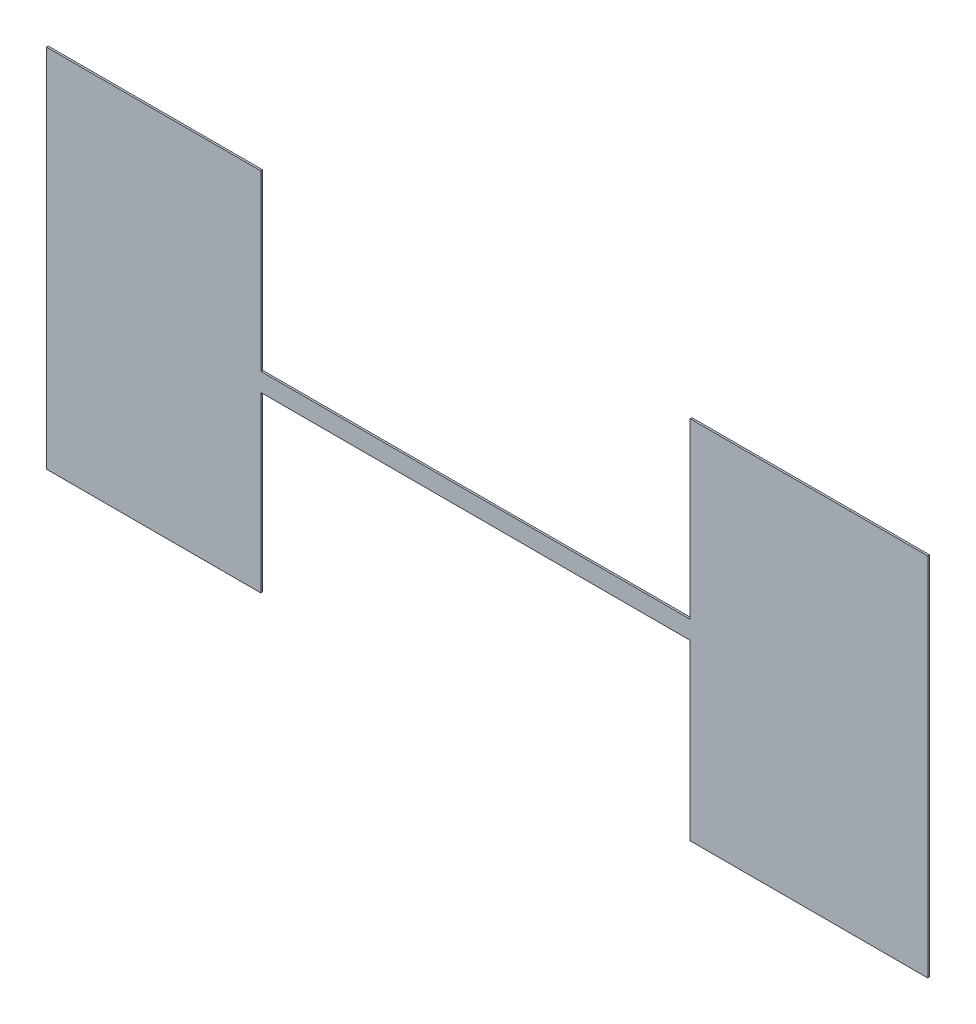
ISO-10303-21;
HEADER;
FILE_DESCRIPTION(('STEP AP214'),'2;1');
FILE_NAME('part.step','',(''),(''),'','','');
FILE_SCHEMA(('AUTOMOTIVE_DESIGN { 1 0 10303 214 1 1 1 1 }'));
ENDSEC;
DATA;
#1=APPLICATION_CONTEXT('core data for automotive mechanical design processes');
#2=APPLICATION_PROTOCOL_DEFINITION('international standard','automotive_design',2000,#1);
#3=PRODUCT_CONTEXT('',#1,'mechanical');
#4=PRODUCT('Part','Part','',(#3));
#5=PRODUCT_RELATED_PRODUCT_CATEGORY('part','',(#4));
#6=PRODUCT_DEFINITION_FORMATION('','',#4);
#7=PRODUCT_DEFINITION_CONTEXT('part definition',#1,'design');
#8=PRODUCT_DEFINITION('design','',#6,#7);
#9=PRODUCT_DEFINITION_SHAPE('','',#8);
#10=(LENGTH_UNIT() NAMED_UNIT(*) SI_UNIT(.MILLI.,.METRE.));
#11=(NAMED_UNIT(*) PLANE_ANGLE_UNIT() SI_UNIT($,.RADIAN.));
#12=(NAMED_UNIT(*) SI_UNIT($,.STERADIAN.) SOLID_ANGLE_UNIT());
#13=UNCERTAINTY_MEASURE_WITH_UNIT(LENGTH_MEASURE(1.E-05),#10,'distance_accuracy_value','');
#14=(GEOMETRIC_REPRESENTATION_CONTEXT(3) GLOBAL_UNCERTAINTY_ASSIGNED_CONTEXT((#13)) GLOBAL_UNIT_ASSIGNED_CONTEXT((#10,
#11,#12)) REPRESENTATION_CONTEXT('',''));
#15=CARTESIAN_POINT('',(0.,0.,0.));
#16=DIRECTION('',(0.,0.,1.));
#17=DIRECTION('',(1.,0.,0.));
#18=AXIS2_PLACEMENT_3D('',#15,#16,#17);
#19=CARTESIAN_POINT('',(-650.000000000001,1000.,10.));
#20=DIRECTION('',(1.,0.,0.));
#21=DIRECTION('',(0.,1.,0.));
#22=AXIS2_PLACEMENT_3D('',#19,#20,#21);
#23=PLANE('',#22);
#24=DIRECTION('',(0.,-1.,0.));
#25=VECTOR('',#24,1.);
#26=CARTESIAN_POINT('',(-650.000000000001,1000.,0.));
#27=LINE('',#26,#25);
#28=CARTESIAN_POINT('',(-650.000000000001,1000.,0.));
#29=VERTEX_POINT('',#28);
#30=CARTESIAN_POINT('',(-650.,-1000.,0.));
#31=VERTEX_POINT('',#30);
#32=EDGE_CURVE('E162',#29,#31,#27,.T.);
#33=ORIENTED_EDGE('',*,*,#32,.T.);
#34=DIRECTION('',(0.,0.,-1.));
#35=VECTOR('',#34,1.);
#36=CARTESIAN_POINT('',(-650.,-1000.,10.));
#37=LINE('',#36,#35);
#38=CARTESIAN_POINT('',(-650.,-1000.,10.));
#39=VERTEX_POINT('',#38);
#40=EDGE_CURVE('E11',#39,#31,#37,.T.);
#41=ORIENTED_EDGE('',*,*,#40,.F.);
#42=DIRECTION('',(0.,-1.,0.));
#43=VECTOR('',#42,1.);
#44=CARTESIAN_POINT('',(-650.000000000001,1000.,10.));
#45=LINE('',#44,#43);
#46=CARTESIAN_POINT('',(-650.000000000001,1000.,10.));
#47=VERTEX_POINT('',#46);
#48=EDGE_CURVE('E184',#47,#39,#45,.T.);
#49=ORIENTED_EDGE('',*,*,#48,.F.);
#50=DIRECTION('',(0.,0.,-1.));
#51=VECTOR('',#50,1.);
#52=CARTESIAN_POINT('',(-650.000000000001,1000.,10.));
#53=LINE('',#52,#51);
#54=EDGE_CURVE('E158',#47,#29,#53,.T.);
#55=ORIENTED_EDGE('',*,*,#54,.T.);
#56=EDGE_LOOP('',(#33,#41,#49,#55));
#57=FACE_BOUND('',#56,.T.);
#58=ADVANCED_FACE('F42',(#57),#23,.F.);
#59=CARTESIAN_POINT('',(-650.,-1000.,10.));
#60=DIRECTION('',(0.,1.,0.));
#61=DIRECTION('',(0.,0.,1.));
#62=AXIS2_PLACEMENT_3D('',#59,#60,#61);
#63=PLANE('',#62);
#64=DIRECTION('',(1.,0.,0.));
#65=VECTOR('',#64,1.);
#66=CARTESIAN_POINT('',(-650.,-1000.,0.));
#67=LINE('',#66,#65);
#68=CARTESIAN_POINT('',(522.999999999999,-1000.,0.));
#69=VERTEX_POINT('',#68);
#70=EDGE_CURVE('E165',#31,#69,#67,.T.);
#71=ORIENTED_EDGE('',*,*,#70,.T.);
#72=DIRECTION('',(0.,0.,-1.));
#73=VECTOR('',#72,1.);
#74=CARTESIAN_POINT('',(522.999999999999,-1000.,10.));
#75=LINE('',#74,#73);
#76=CARTESIAN_POINT('',(522.999999999999,-1000.,10.));
#77=VERTEX_POINT('',#76);
#78=EDGE_CURVE('E50',#77,#69,#75,.T.);
#79=ORIENTED_EDGE('',*,*,#78,.F.);
#80=DIRECTION('',(1.,0.,0.));
#81=VECTOR('',#80,1.);
#82=CARTESIAN_POINT('',(-650.,-1000.,10.));
#83=LINE('',#82,#81);
#84=EDGE_CURVE('E113',#39,#77,#83,.T.);
#85=ORIENTED_EDGE('',*,*,#84,.F.);
#86=ORIENTED_EDGE('',*,*,#40,.T.);
#87=EDGE_LOOP('',(#71,#79,#85,#86));
#88=FACE_BOUND('',#87,.T.);
#89=ADVANCED_FACE('F262',(#88),#63,.F.);
#90=CARTESIAN_POINT('',(523.,-50.,10.));
#91=DIRECTION('',(-1.,0.,0.));
#92=DIRECTION('',(0.,-1.,0.));
#93=AXIS2_PLACEMENT_3D('',#90,#91,#92);
#94=PLANE('',#93);
#95=DIRECTION('',(0.,1.,0.));
#96=VECTOR('',#95,1.);
#97=CARTESIAN_POINT('',(523.,-50.,0.));
#98=LINE('',#97,#96);
#99=CARTESIAN_POINT('',(523.,-50.,0.));
#100=VERTEX_POINT('',#99);
#101=EDGE_CURVE('E167',#69,#100,#98,.T.);
#102=ORIENTED_EDGE('',*,*,#101,.T.);
#103=DIRECTION('',(0.,0.,-1.));
#104=VECTOR('',#103,1.);
#105=CARTESIAN_POINT('',(523.,-50.,10.));
#106=LINE('',#105,#104);
#107=CARTESIAN_POINT('',(523.,-50.,10.));
#108=VERTEX_POINT('',#107);
#109=EDGE_CURVE('E203',#108,#100,#106,.T.);
#110=ORIENTED_EDGE('',*,*,#109,.F.);
#111=DIRECTION('',(0.,1.,0.));
#112=VECTOR('',#111,1.);
#113=CARTESIAN_POINT('',(523.,-50.,10.));
#114=LINE('',#113,#112);
#115=EDGE_CURVE('E211',#77,#108,#114,.T.);
#116=ORIENTED_EDGE('',*,*,#115,.F.);
#117=ORIENTED_EDGE('',*,*,#78,.T.);
#118=EDGE_LOOP('',(#102,#110,#116,#117));
#119=FACE_BOUND('',#118,.T.);
#120=ADVANCED_FACE('F209',(#119),#94,.F.);
#121=CARTESIAN_POINT('',(2872.5,-49.9999999999998,10.));
#122=DIRECTION('',(0.,1.,0.));
#123=DIRECTION('',(-1.,0.,0.));
#124=AXIS2_PLACEMENT_3D('',#121,#122,#123);
#125=PLANE('',#124);
#126=DIRECTION('',(1.,0.,0.));
#127=VECTOR('',#126,1.);
#128=CARTESIAN_POINT('',(2872.5,-49.9999999999998,0.));
#129=LINE('',#128,#127);
#130=CARTESIAN_POINT('',(2872.5,-49.9999999999998,0.));
#131=VERTEX_POINT('',#130);
#132=EDGE_CURVE('E169',#100,#131,#129,.T.);
#133=ORIENTED_EDGE('',*,*,#132,.T.);
#134=DIRECTION('',(0.,0.,-1.));
#135=VECTOR('',#134,1.);
#136=CARTESIAN_POINT('',(2872.5,-49.9999999999998,10.));
#137=LINE('',#136,#135);
#138=CARTESIAN_POINT('',(2872.5,-49.9999999999998,10.));
#139=VERTEX_POINT('',#138);
#140=EDGE_CURVE('E200',#139,#131,#137,.T.);
#141=ORIENTED_EDGE('',*,*,#140,.F.);
#142=DIRECTION('',(1.,0.,0.));
#143=VECTOR('',#142,1.);
#144=CARTESIAN_POINT('',(2872.5,-49.9999999999998,10.));
#145=LINE('',#144,#143);
#146=EDGE_CURVE('E229',#108,#139,#145,.T.);
#147=ORIENTED_EDGE('',*,*,#146,.F.);
#148=ORIENTED_EDGE('',*,*,#109,.T.);
#149=EDGE_LOOP('',(#133,#141,#147,#148));
#150=FACE_BOUND('',#149,.T.);
#151=ADVANCED_FACE('F220',(#150),#125,.F.);
#152=CARTESIAN_POINT('',(2872.5,-1000.,10.));
#153=DIRECTION('',(1.,0.,0.));
#154=DIRECTION('',(0.,0.,-1.));
#155=AXIS2_PLACEMENT_3D('',#152,#153,#154);
#156=PLANE('',#155);
#157=DIRECTION('',(0.,-1.,0.));
#158=VECTOR('',#157,1.);
#159=CARTESIAN_POINT('',(2872.5,-1000.,0.));
#160=LINE('',#159,#158);
#161=CARTESIAN_POINT('',(2872.5,-1000.,0.));
#162=VERTEX_POINT('',#161);
#163=EDGE_CURVE('E171',#131,#162,#160,.T.);
#164=ORIENTED_EDGE('',*,*,#163,.T.);
#165=DIRECTION('',(0.,0.,-1.));
#166=VECTOR('',#165,1.);
#167=CARTESIAN_POINT('',(2872.5,-1000.,10.));
#168=LINE('',#167,#166);
#169=CARTESIAN_POINT('',(2872.5,-1000.,10.));
#170=VERTEX_POINT('',#169);
#171=EDGE_CURVE('E197',#170,#162,#168,.T.);
#172=ORIENTED_EDGE('',*,*,#171,.F.);
#173=DIRECTION('',(0.,-1.,0.));
#174=VECTOR('',#173,1.);
#175=CARTESIAN_POINT('',(2872.5,-1000.,10.));
#176=LINE('',#175,#174);
#177=EDGE_CURVE('E226',#139,#170,#176,.T.);
#178=ORIENTED_EDGE('',*,*,#177,.F.);
#179=ORIENTED_EDGE('',*,*,#140,.T.);
#180=EDGE_LOOP('',(#164,#172,#178,#179));
#181=FACE_BOUND('',#180,.T.);
#182=ADVANCED_FACE('F224',(#181),#156,.F.);
#183=CARTESIAN_POINT('',(4172.5,-999.999999999999,10.));
#184=DIRECTION('',(0.,1.,0.));
#185=DIRECTION('',(-1.,0.,0.));
#186=AXIS2_PLACEMENT_3D('',#183,#184,#185);
#187=PLANE('',#186);
#188=DIRECTION('',(1.,0.,0.));
#189=VECTOR('',#188,1.);
#190=CARTESIAN_POINT('',(4172.5,-999.999999999999,0.));
#191=LINE('',#190,#189);
#192=CARTESIAN_POINT('',(4172.5,-999.999999999999,0.));
#193=VERTEX_POINT('',#192);
#194=EDGE_CURVE('E173',#162,#193,#191,.T.);
#195=ORIENTED_EDGE('',*,*,#194,.T.);
#196=DIRECTION('',(0.,0.,-1.));
#197=VECTOR('',#196,1.);
#198=CARTESIAN_POINT('',(4172.5,-999.999999999999,10.));
#199=LINE('',#198,#197);
#200=CARTESIAN_POINT('',(4172.5,-999.999999999999,10.));
#201=VERTEX_POINT('',#200);
#202=EDGE_CURVE('E194',#201,#193,#199,.T.);
#203=ORIENTED_EDGE('',*,*,#202,.F.);
#204=DIRECTION('',(1.,0.,0.));
#205=VECTOR('',#204,1.);
#206=CARTESIAN_POINT('',(4172.5,-999.999999999999,10.));
#207=LINE('',#206,#205);
#208=EDGE_CURVE('E228',#170,#201,#207,.T.);
#209=ORIENTED_EDGE('',*,*,#208,.F.);
#210=ORIENTED_EDGE('',*,*,#171,.T.);
#211=EDGE_LOOP('',(#195,#203,#209,#210));
#212=FACE_BOUND('',#211,.T.);
#213=ADVANCED_FACE('F275',(#212),#187,.F.);
#214=CARTESIAN_POINT('',(4172.5,-999.999999999999,10.));
#215=DIRECTION('',(-1.,0.,0.));
#216=DIRECTION('',(0.,0.,1.));
#217=AXIS2_PLACEMENT_3D('',#214,#215,#216);
#218=PLANE('',#217);
#219=DIRECTION('',(0.,1.,0.));
#220=VECTOR('',#219,1.);
#221=CARTESIAN_POINT('',(4172.5,-999.999999999999,0.));
#222=LINE('',#221,#220);
#223=CARTESIAN_POINT('',(4172.5,1000.,0.));
#224=VERTEX_POINT('',#223);
#225=EDGE_CURVE('E175',#193,#224,#222,.T.);
#226=ORIENTED_EDGE('',*,*,#225,.T.);
#227=DIRECTION('',(0.,0.,-1.));
#228=VECTOR('',#227,1.);
#229=CARTESIAN_POINT('',(4172.5,1000.,10.));
#230=LINE('',#229,#228);
#231=CARTESIAN_POINT('',(4172.5,1000.,10.));
#232=VERTEX_POINT('',#231);
#233=EDGE_CURVE('E191',#232,#224,#230,.T.);
#234=ORIENTED_EDGE('',*,*,#233,.F.);
#235=DIRECTION('',(0.,1.,0.));
#236=VECTOR('',#235,1.);
#237=CARTESIAN_POINT('',(4172.5,-999.999999999999,10.));
#238=LINE('',#237,#236);
#239=EDGE_CURVE('E231',#201,#232,#238,.T.);
#240=ORIENTED_EDGE('',*,*,#239,.F.);
#241=ORIENTED_EDGE('',*,*,#202,.T.);
#242=EDGE_LOOP('',(#226,#234,#240,#241));
#243=FACE_BOUND('',#242,.T.);
#244=ADVANCED_FACE('F278',(#243),#218,.F.);
#245=CARTESIAN_POINT('',(4172.5,1000.,10.));
#246=DIRECTION('',(0.,-1.,0.));
#247=DIRECTION('',(1.,0.,0.));
#248=AXIS2_PLACEMENT_3D('',#245,#246,#247);
#249=PLANE('',#248);
#250=DIRECTION('',(-1.,0.,0.));
#251=VECTOR('',#250,1.);
#252=CARTESIAN_POINT('',(4172.5,1000.,0.));
#253=LINE('',#252,#251);
#254=CARTESIAN_POINT('',(2872.5,1000.,0.));
#255=VERTEX_POINT('',#254);
#256=EDGE_CURVE('E177',#224,#255,#253,.T.);
#257=ORIENTED_EDGE('',*,*,#256,.T.);
#258=DIRECTION('',(0.,0.,-1.));
#259=VECTOR('',#258,1.);
#260=CARTESIAN_POINT('',(2872.5,1000.,10.));
#261=LINE('',#260,#259);
#262=CARTESIAN_POINT('',(2872.5,1000.,10.));
#263=VERTEX_POINT('',#262);
#264=EDGE_CURVE('E188',#263,#255,#261,.T.);
#265=ORIENTED_EDGE('',*,*,#264,.F.);
#266=DIRECTION('',(-1.,0.,0.));
#267=VECTOR('',#266,1.);
#268=CARTESIAN_POINT('',(4172.5,1000.,10.));
#269=LINE('',#268,#267);
#270=EDGE_CURVE('E237',#232,#263,#269,.T.);
#271=ORIENTED_EDGE('',*,*,#270,.F.);
#272=ORIENTED_EDGE('',*,*,#233,.T.);
#273=EDGE_LOOP('',(#257,#265,#271,#272));
#274=FACE_BOUND('',#273,.T.);
#275=ADVANCED_FACE('F243',(#274),#249,.F.);
#276=CARTESIAN_POINT('',(2872.5,50.0000000000002,10.));
#277=DIRECTION('',(1.,0.,0.));
#278=DIRECTION('',(0.,0.,-1.));
#279=AXIS2_PLACEMENT_3D('',#276,#277,#278);
#280=PLANE('',#279);
#281=DIRECTION('',(0.,-1.,0.));
#282=VECTOR('',#281,1.);
#283=CARTESIAN_POINT('',(2872.5,50.0000000000002,0.));
#284=LINE('',#283,#282);
#285=CARTESIAN_POINT('',(2872.5,50.0000000000002,0.));
#286=VERTEX_POINT('',#285);
#287=EDGE_CURVE('E179',#255,#286,#284,.T.);
#288=ORIENTED_EDGE('',*,*,#287,.T.);
#289=DIRECTION('',(0.,0.,-1.));
#290=VECTOR('',#289,1.);
#291=CARTESIAN_POINT('',(2872.5,50.0000000000002,10.));
#292=LINE('',#291,#290);
#293=CARTESIAN_POINT('',(2872.5,50.0000000000002,10.));
#294=VERTEX_POINT('',#293);
#295=EDGE_CURVE('E153',#294,#286,#292,.T.);
#296=ORIENTED_EDGE('',*,*,#295,.F.);
#297=DIRECTION('',(0.,-1.,0.));
#298=VECTOR('',#297,1.);
#299=CARTESIAN_POINT('',(2872.5,50.0000000000002,10.));
#300=LINE('',#299,#298);
#301=EDGE_CURVE('E144',#263,#294,#300,.T.);
#302=ORIENTED_EDGE('',*,*,#301,.F.);
#303=ORIENTED_EDGE('',*,*,#264,.T.);
#304=EDGE_LOOP('',(#288,#296,#302,#303));
#305=FACE_BOUND('',#304,.T.);
#306=ADVANCED_FACE('F247',(#305),#280,.F.);
#307=CARTESIAN_POINT('',(2872.5,50.0000000000002,10.));
#308=DIRECTION('',(0.,-1.,0.));
#309=DIRECTION('',(1.,0.,0.));
#310=AXIS2_PLACEMENT_3D('',#307,#308,#309);
#311=PLANE('',#310);
#312=DIRECTION('',(-1.,0.,0.));
#313=VECTOR('',#312,1.);
#314=CARTESIAN_POINT('',(2872.5,50.0000000000002,0.));
#315=LINE('',#314,#313);
#316=CARTESIAN_POINT('',(523.,49.9999999999999,0.));
#317=VERTEX_POINT('',#316);
#318=EDGE_CURVE('E152',#286,#317,#315,.T.);
#319=ORIENTED_EDGE('',*,*,#318,.T.);
#320=DIRECTION('',(0.,0.,-1.));
#321=VECTOR('',#320,1.);
#322=CARTESIAN_POINT('',(523.,49.9999999999999,10.));
#323=LINE('',#322,#321);
#324=CARTESIAN_POINT('',(523.,49.9999999999999,10.));
#325=VERTEX_POINT('',#324);
#326=EDGE_CURVE('E149',#325,#317,#323,.T.);
#327=ORIENTED_EDGE('',*,*,#326,.F.);
#328=DIRECTION('',(-1.,0.,0.));
#329=VECTOR('',#328,1.);
#330=CARTESIAN_POINT('',(2872.5,50.0000000000002,10.));
#331=LINE('',#330,#329);
#332=EDGE_CURVE('E138',#294,#325,#331,.T.);
#333=ORIENTED_EDGE('',*,*,#332,.F.);
#334=ORIENTED_EDGE('',*,*,#295,.T.);
#335=EDGE_LOOP('',(#319,#327,#333,#334));
#336=FACE_BOUND('',#335,.T.);
#337=ADVANCED_FACE('F150',(#336),#311,.F.);
#338=CARTESIAN_POINT('',(522.999999999999,1000.,10.));
#339=DIRECTION('',(-1.,0.,0.));
#340=DIRECTION('',(0.,-1.,0.));
#341=AXIS2_PLACEMENT_3D('',#338,#339,#340);
#342=PLANE('',#341);
#343=DIRECTION('',(0.,1.,0.));
#344=VECTOR('',#343,1.);
#345=CARTESIAN_POINT('',(522.999999999999,1000.,0.));
#346=LINE('',#345,#344);
#347=CARTESIAN_POINT('',(522.999999999999,1000.,0.));
#348=VERTEX_POINT('',#347);
#349=EDGE_CURVE('E99',#317,#348,#346,.T.);
#350=ORIENTED_EDGE('',*,*,#349,.T.);
#351=DIRECTION('',(0.,0.,-1.));
#352=VECTOR('',#351,1.);
#353=CARTESIAN_POINT('',(522.999999999999,1000.,10.));
#354=LINE('',#353,#352);
#355=CARTESIAN_POINT('',(522.999999999999,1000.,10.));
#356=VERTEX_POINT('',#355);
#357=EDGE_CURVE('E154',#356,#348,#354,.T.);
#358=ORIENTED_EDGE('',*,*,#357,.F.);
#359=DIRECTION('',(0.,1.,0.));
#360=VECTOR('',#359,1.);
#361=CARTESIAN_POINT('',(522.999999999999,1000.,10.));
#362=LINE('',#361,#360);
#363=EDGE_CURVE('E142',#325,#356,#362,.T.);
#364=ORIENTED_EDGE('',*,*,#363,.F.);
#365=ORIENTED_EDGE('',*,*,#326,.T.);
#366=EDGE_LOOP('',(#350,#358,#364,#365));
#367=FACE_BOUND('',#366,.T.);
#368=ADVANCED_FACE('F156',(#367),#342,.F.);
#369=CARTESIAN_POINT('',(-650.000000000001,1000.,10.));
#370=DIRECTION('',(0.,-1.,0.));
#371=DIRECTION('',(0.,0.,-1.));
#372=AXIS2_PLACEMENT_3D('',#369,#370,#371);
#373=PLANE('',#372);
#374=DIRECTION('',(-1.,0.,0.));
#375=VECTOR('',#374,1.);
#376=CARTESIAN_POINT('',(-650.000000000001,1000.,0.));
#377=LINE('',#376,#375);
#378=EDGE_CURVE('E105',#348,#29,#377,.T.);
#379=ORIENTED_EDGE('',*,*,#378,.T.);
#380=ORIENTED_EDGE('',*,*,#54,.F.);
#381=DIRECTION('',(-1.,0.,0.));
#382=VECTOR('',#381,1.);
#383=CARTESIAN_POINT('',(-650.000000000001,1000.,10.));
#384=LINE('',#383,#382);
#385=EDGE_CURVE('E58',#356,#47,#384,.T.);
#386=ORIENTED_EDGE('',*,*,#385,.F.);
#387=ORIENTED_EDGE('',*,*,#357,.T.);
#388=EDGE_LOOP('',(#379,#380,#386,#387));
#389=FACE_BOUND('',#388,.T.);
#390=ADVANCED_FACE('F251',(#389),#373,.F.);
#391=CARTESIAN_POINT('',(0.,0.,10.));
#392=DIRECTION('',(0.,0.,1.));
#393=DIRECTION('',(1.,0.,0.));
#394=AXIS2_PLACEMENT_3D('',#391,#392,#393);
#395=PLANE('',#394);
#396=ORIENTED_EDGE('',*,*,#48,.T.);
#397=ORIENTED_EDGE('',*,*,#84,.T.);
#398=ORIENTED_EDGE('',*,*,#115,.T.);
#399=ORIENTED_EDGE('',*,*,#146,.T.);
#400=ORIENTED_EDGE('',*,*,#177,.T.);
#401=ORIENTED_EDGE('',*,*,#208,.T.);
#402=ORIENTED_EDGE('',*,*,#239,.T.);
#403=ORIENTED_EDGE('',*,*,#270,.T.);
#404=ORIENTED_EDGE('',*,*,#301,.T.);
#405=ORIENTED_EDGE('',*,*,#332,.T.);
#406=ORIENTED_EDGE('',*,*,#363,.T.);
#407=ORIENTED_EDGE('',*,*,#385,.T.);
#408=EDGE_LOOP('',(#396,#397,#398,#399,#400,#401,#402,#403,#404,#405,#406,#407));
#409=FACE_BOUND('',#408,.T.);
#410=ADVANCED_FACE('F140',(#409),#395,.T.);
#411=CARTESIAN_POINT('',(0.,0.,0.));
#412=DIRECTION('',(0.,0.,1.));
#413=DIRECTION('',(1.,0.,0.));
#414=AXIS2_PLACEMENT_3D('',#411,#412,#413);
#415=PLANE('',#414);
#416=ORIENTED_EDGE('',*,*,#32,.F.);
#417=ORIENTED_EDGE('',*,*,#378,.F.);
#418=ORIENTED_EDGE('',*,*,#349,.F.);
#419=ORIENTED_EDGE('',*,*,#318,.F.);
#420=ORIENTED_EDGE('',*,*,#287,.F.);
#421=ORIENTED_EDGE('',*,*,#256,.F.);
#422=ORIENTED_EDGE('',*,*,#225,.F.);
#423=ORIENTED_EDGE('',*,*,#194,.F.);
#424=ORIENTED_EDGE('',*,*,#163,.F.);
#425=ORIENTED_EDGE('',*,*,#132,.F.);
#426=ORIENTED_EDGE('',*,*,#101,.F.);
#427=ORIENTED_EDGE('',*,*,#70,.F.);
#428=EDGE_LOOP('',(#416,#417,#418,#419,#420,#421,#422,#423,#424,#425,#426,#427));
#429=FACE_BOUND('',#428,.T.);
#430=ADVANCED_FACE('F215',(#429),#415,.F.);
#431=CLOSED_SHELL('',(#58,#89,#120,#151,#182,#213,#244,#275,#306,#337,#368,#390,#410,#430));
#432=MANIFOLD_SOLID_BREP('B2',#431);
#433=ADVANCED_BREP_SHAPE_REPRESENTATION('',(#18,#432),#14);
#434=SHAPE_DEFINITION_REPRESENTATION(#9,#433);
ENDSEC;
END-ISO-10303-21;
